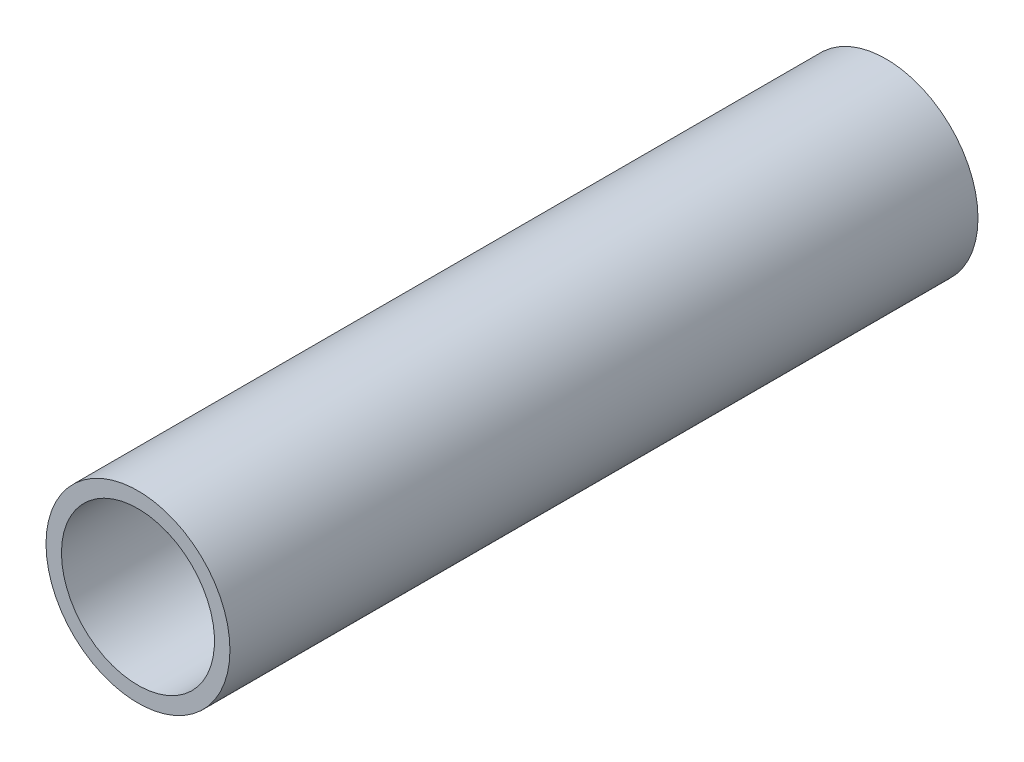
ISO-10303-21;
HEADER;
FILE_DESCRIPTION(('STEP AP214'),'2;1');
FILE_NAME('part.step','',(''),(''),'','','');
FILE_SCHEMA(('AUTOMOTIVE_DESIGN { 1 0 10303 214 1 1 1 1 }'));
ENDSEC;
DATA;
#1=APPLICATION_CONTEXT('core data for automotive mechanical design processes');
#2=APPLICATION_PROTOCOL_DEFINITION('international standard','automotive_design',2000,#1);
#3=PRODUCT_CONTEXT('',#1,'mechanical');
#4=PRODUCT('Part','Part','',(#3));
#5=PRODUCT_RELATED_PRODUCT_CATEGORY('part','',(#4));
#6=PRODUCT_DEFINITION_FORMATION('','',#4);
#7=PRODUCT_DEFINITION_CONTEXT('part definition',#1,'design');
#8=PRODUCT_DEFINITION('design','',#6,#7);
#9=PRODUCT_DEFINITION_SHAPE('','',#8);
#10=(LENGTH_UNIT() NAMED_UNIT(*) SI_UNIT(.MILLI.,.METRE.));
#11=(NAMED_UNIT(*) PLANE_ANGLE_UNIT() SI_UNIT($,.RADIAN.));
#12=(NAMED_UNIT(*) SI_UNIT($,.STERADIAN.) SOLID_ANGLE_UNIT());
#13=UNCERTAINTY_MEASURE_WITH_UNIT(LENGTH_MEASURE(1.E-05),#10,'distance_accuracy_value','');
#14=(GEOMETRIC_REPRESENTATION_CONTEXT(3) GLOBAL_UNCERTAINTY_ASSIGNED_CONTEXT((#13)) GLOBAL_UNIT_ASSIGNED_CONTEXT((#10,
#11,#12)) REPRESENTATION_CONTEXT('',''));
#15=CARTESIAN_POINT('',(0.,0.,0.));
#16=DIRECTION('',(0.,0.,1.));
#17=DIRECTION('',(1.,0.,0.));
#18=AXIS2_PLACEMENT_3D('',#15,#16,#17);
#19=CARTESIAN_POINT('',(0.,0.,38.735));
#20=DIRECTION('',(0.,0.,-1.));
#21=DIRECTION('',(-1.,0.,0.));
#22=AXIS2_PLACEMENT_3D('',#19,#20,#21);
#23=CYLINDRICAL_SURFACE('',#22,3.9624);
#24=CARTESIAN_POINT('',(0.,0.,0.));
#25=DIRECTION('',(0.,0.,-1.));
#26=DIRECTION('',(-1.,0.,0.));
#27=AXIS2_PLACEMENT_3D('',#24,#25,#26);
#28=CIRCLE('',#27,3.9624);
#29=CARTESIAN_POINT('',(-3.9624,0.,0.));
#30=VERTEX_POINT('',#29);
#31=EDGE_CURVE('E18',#30,#30,#28,.T.);
#32=ORIENTED_EDGE('',*,*,#31,.T.);
#33=EDGE_LOOP('',(#32));
#34=FACE_BOUND('',#33,.T.);
#35=CARTESIAN_POINT('',(0.,0.,38.735));
#36=DIRECTION('',(0.,0.,-1.));
#37=DIRECTION('',(-1.,0.,0.));
#38=AXIS2_PLACEMENT_3D('',#35,#36,#37);
#39=CIRCLE('',#38,3.9624);
#40=CARTESIAN_POINT('',(-3.9624,0.,38.735));
#41=VERTEX_POINT('',#40);
#42=EDGE_CURVE('E27',#41,#41,#39,.T.);
#43=ORIENTED_EDGE('',*,*,#42,.F.);
#44=EDGE_LOOP('',(#43));
#45=FACE_BOUND('',#44,.T.);
#46=ADVANCED_FACE('F14',(#34,#45),#23,.F.);
#47=CARTESIAN_POINT('',(-4.81965,-4.81965,0.));
#48=DIRECTION('',(0.,0.,1.));
#49=DIRECTION('',(1.,0.,0.));
#50=AXIS2_PLACEMENT_3D('',#47,#48,#49);
#51=PLANE('',#50);
#52=ORIENTED_EDGE('',*,*,#31,.F.);
#53=EDGE_LOOP('',(#52));
#54=FACE_BOUND('',#53,.T.);
#55=CARTESIAN_POINT('',(0.,0.,0.));
#56=DIRECTION('',(0.,0.,-1.));
#57=DIRECTION('',(-1.,0.,0.));
#58=AXIS2_PLACEMENT_3D('',#55,#56,#57);
#59=CIRCLE('',#58,4.7625);
#60=CARTESIAN_POINT('',(-4.7625,0.,0.));
#61=VERTEX_POINT('',#60);
#62=EDGE_CURVE('E22',#61,#61,#59,.T.);
#63=ORIENTED_EDGE('',*,*,#62,.T.);
#64=EDGE_LOOP('',(#63));
#65=FACE_BOUND('',#64,.T.);
#66=ADVANCED_FACE('F37',(#54,#65),#51,.F.);
#67=CARTESIAN_POINT('',(-4.81965,-4.81965,38.735));
#68=DIRECTION('',(0.,0.,1.));
#69=DIRECTION('',(1.,0.,0.));
#70=AXIS2_PLACEMENT_3D('',#67,#68,#69);
#71=PLANE('',#70);
#72=ORIENTED_EDGE('',*,*,#42,.T.);
#73=EDGE_LOOP('',(#72));
#74=FACE_BOUND('',#73,.T.);
#75=CARTESIAN_POINT('',(0.,0.,38.735));
#76=DIRECTION('',(0.,0.,-1.));
#77=DIRECTION('',(-1.,0.,0.));
#78=AXIS2_PLACEMENT_3D('',#75,#76,#77);
#79=CIRCLE('',#78,4.7625);
#80=CARTESIAN_POINT('',(-4.7625,0.,38.735));
#81=VERTEX_POINT('',#80);
#82=EDGE_CURVE('E10',#81,#81,#79,.F.);
#83=ORIENTED_EDGE('',*,*,#82,.T.);
#84=EDGE_LOOP('',(#83));
#85=FACE_BOUND('',#84,.T.);
#86=ADVANCED_FACE('F16',(#74,#85),#71,.T.);
#87=CARTESIAN_POINT('',(0.,0.,38.735));
#88=DIRECTION('',(0.,0.,-1.));
#89=DIRECTION('',(-1.,0.,0.));
#90=AXIS2_PLACEMENT_3D('',#87,#88,#89);
#91=CYLINDRICAL_SURFACE('',#90,4.7625);
#92=ORIENTED_EDGE('',*,*,#62,.F.);
#93=EDGE_LOOP('',(#92));
#94=FACE_BOUND('',#93,.T.);
#95=ORIENTED_EDGE('',*,*,#82,.F.);
#96=EDGE_LOOP('',(#95));
#97=FACE_BOUND('',#96,.T.);
#98=ADVANCED_FACE('F42',(#94,#97),#91,.T.);
#99=CLOSED_SHELL('',(#46,#66,#86,#98));
#100=MANIFOLD_SOLID_BREP('B1',#99);
#101=ADVANCED_BREP_SHAPE_REPRESENTATION('',(#18,#100),#14);
#102=SHAPE_DEFINITION_REPRESENTATION(#9,#101);
ENDSEC;
END-ISO-10303-21;
